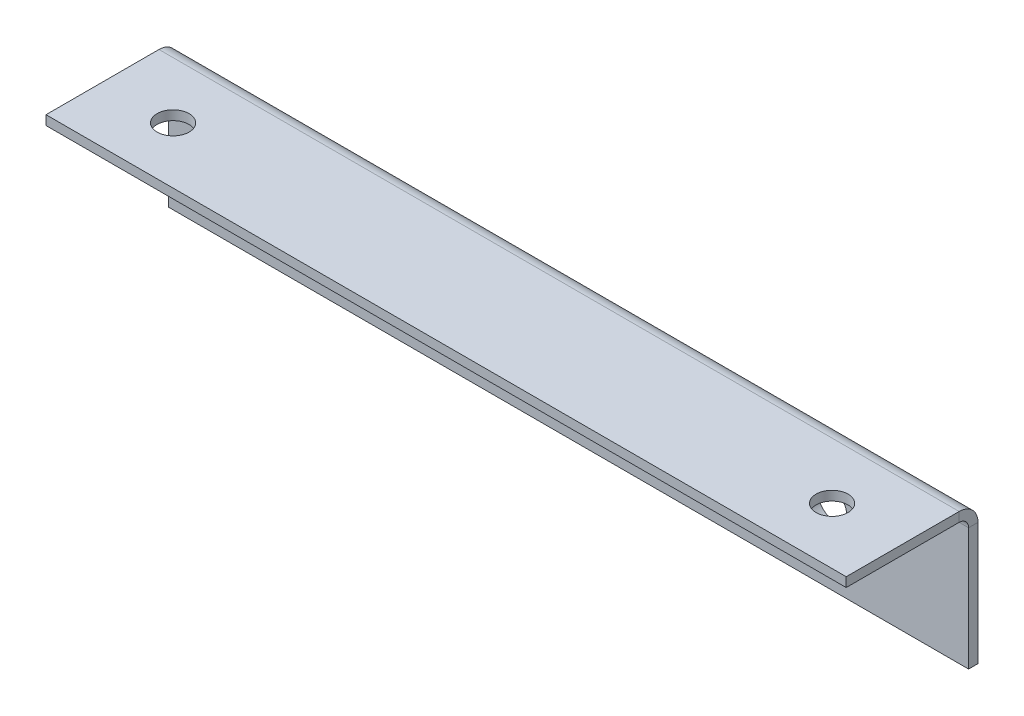
ISO-10303-21;
HEADER;
FILE_DESCRIPTION(('STEP AP214'),'2;1');
FILE_NAME('part.step','',(''),(''),'','','');
FILE_SCHEMA(('AUTOMOTIVE_DESIGN { 1 0 10303 214 1 1 1 1 }'));
ENDSEC;
DATA;
#1=APPLICATION_CONTEXT('core data for automotive mechanical design processes');
#2=APPLICATION_PROTOCOL_DEFINITION('international standard','automotive_design',2000,#1);
#3=PRODUCT_CONTEXT('',#1,'mechanical');
#4=PRODUCT('Part','Part','',(#3));
#5=PRODUCT_RELATED_PRODUCT_CATEGORY('part','',(#4));
#6=PRODUCT_DEFINITION_FORMATION('','',#4);
#7=PRODUCT_DEFINITION_CONTEXT('part definition',#1,'design');
#8=PRODUCT_DEFINITION('design','',#6,#7);
#9=PRODUCT_DEFINITION_SHAPE('','',#8);
#10=(LENGTH_UNIT() NAMED_UNIT(*) SI_UNIT(.MILLI.,.METRE.));
#11=(NAMED_UNIT(*) PLANE_ANGLE_UNIT() SI_UNIT($,.RADIAN.));
#12=(NAMED_UNIT(*) SI_UNIT($,.STERADIAN.) SOLID_ANGLE_UNIT());
#13=UNCERTAINTY_MEASURE_WITH_UNIT(LENGTH_MEASURE(1.E-05),#10,'distance_accuracy_value','');
#14=(GEOMETRIC_REPRESENTATION_CONTEXT(3) GLOBAL_UNCERTAINTY_ASSIGNED_CONTEXT((#13)) GLOBAL_UNIT_ASSIGNED_CONTEXT((#10,
#11,#12)) REPRESENTATION_CONTEXT('',''));
#15=CARTESIAN_POINT('',(0.,0.,0.));
#16=DIRECTION('',(0.,0.,1.));
#17=DIRECTION('',(1.,0.,0.));
#18=AXIS2_PLACEMENT_3D('',#15,#16,#17);
#19=CARTESIAN_POINT('',(-42.5,7.49999999999999,-1.));
#20=DIRECTION('',(-1.,0.,0.));
#21=DIRECTION('',(0.,0.,1.));
#22=AXIS2_PLACEMENT_3D('',#19,#20,#21);
#23=PLANE('',#22);
#24=DIRECTION('',(0.,-1.,0.));
#25=VECTOR('',#24,1.);
#26=CARTESIAN_POINT('',(-42.5,7.49999999999999,0.));
#27=LINE('',#26,#25);
#28=CARTESIAN_POINT('',(-42.5,5.5,0.));
#29=VERTEX_POINT('',#28);
#30=CARTESIAN_POINT('',(-42.5,-7.50000000000001,0.));
#31=VERTEX_POINT('',#30);
#32=EDGE_CURVE('E123',#29,#31,#27,.T.);
#33=ORIENTED_EDGE('',*,*,#32,.F.);
#34=DIRECTION('',(0.,0.,-1.));
#35=VECTOR('',#34,1.);
#36=CARTESIAN_POINT('',(-42.5,5.5,0.));
#37=LINE('',#36,#35);
#38=CARTESIAN_POINT('',(-42.5,5.49999999999999,-1.00000000000001));
#39=VERTEX_POINT('',#38);
#40=EDGE_CURVE('E132',#29,#39,#37,.T.);
#41=ORIENTED_EDGE('',*,*,#40,.T.);
#42=DIRECTION('',(0.,-1.,0.));
#43=VECTOR('',#42,1.);
#44=CARTESIAN_POINT('',(-42.5,7.49999999999999,-1.));
#45=LINE('',#44,#43);
#46=CARTESIAN_POINT('',(-42.5,-7.50000000000001,-1.));
#47=VERTEX_POINT('',#46);
#48=EDGE_CURVE('E119',#39,#47,#45,.T.);
#49=ORIENTED_EDGE('',*,*,#48,.T.);
#50=DIRECTION('',(0.,0.,1.));
#51=VECTOR('',#50,1.);
#52=CARTESIAN_POINT('',(-42.5,-7.50000000000001,-1.));
#53=LINE('',#52,#51);
#54=EDGE_CURVE('E74',#47,#31,#53,.T.);
#55=ORIENTED_EDGE('',*,*,#54,.T.);
#56=EDGE_LOOP('',(#33,#41,#49,#55));
#57=FACE_BOUND('',#56,.T.);
#58=ADVANCED_FACE('F71',(#57),#23,.T.);
#59=CARTESIAN_POINT('',(0.,0.,-1.));
#60=DIRECTION('',(0.,0.,-1.));
#61=DIRECTION('',(-1.,0.,0.));
#62=AXIS2_PLACEMENT_3D('',#59,#60,#61);
#63=PLANE('',#62);
#64=CARTESIAN_POINT('',(-27.5,0.,-0.999999999999999));
#65=DIRECTION('',(0.,0.,-1.));
#66=DIRECTION('',(-1.,0.,0.));
#67=AXIS2_PLACEMENT_3D('',#64,#65,#66);
#68=CIRCLE('',#67,2.1);
#69=CARTESIAN_POINT('',(-29.6,0.,-0.999999999999999));
#70=VERTEX_POINT('',#69);
#71=EDGE_CURVE('E157',#70,#70,#68,.T.);
#72=ORIENTED_EDGE('',*,*,#71,.F.);
#73=EDGE_LOOP('',(#72));
#74=FACE_BOUND('',#73,.T.);
#75=CARTESIAN_POINT('',(27.5,0.,-0.999999999999999));
#76=DIRECTION('',(0.,0.,-1.));
#77=DIRECTION('',(-1.,0.,0.));
#78=AXIS2_PLACEMENT_3D('',#75,#76,#77);
#79=CIRCLE('',#78,2.1);
#80=CARTESIAN_POINT('',(25.4,0.,-0.999999999999999));
#81=VERTEX_POINT('',#80);
#82=EDGE_CURVE('E190',#81,#81,#79,.T.);
#83=ORIENTED_EDGE('',*,*,#82,.F.);
#84=EDGE_LOOP('',(#83));
#85=FACE_BOUND('',#84,.T.);
#86=ORIENTED_EDGE('',*,*,#48,.F.);
#87=DIRECTION('',(-1.,0.,0.));
#88=VECTOR('',#87,1.);
#89=CARTESIAN_POINT('',(-42.5,5.49999999999999,-1.00000000000001));
#90=LINE('',#89,#88);
#91=CARTESIAN_POINT('',(42.5,5.5,-1.));
#92=VERTEX_POINT('',#91);
#93=EDGE_CURVE('E149',#39,#92,#90,.F.);
#94=ORIENTED_EDGE('',*,*,#93,.T.);
#95=DIRECTION('',(0.,1.,0.));
#96=VECTOR('',#95,1.);
#97=CARTESIAN_POINT('',(42.5,7.50000000000001,-1.));
#98=LINE('',#97,#96);
#99=CARTESIAN_POINT('',(42.5,-7.49999999999999,-1.));
#100=VERTEX_POINT('',#99);
#101=EDGE_CURVE('E128',#100,#92,#98,.T.);
#102=ORIENTED_EDGE('',*,*,#101,.F.);
#103=DIRECTION('',(1.,0.,0.));
#104=VECTOR('',#103,1.);
#105=CARTESIAN_POINT('',(42.5,-7.49999999999999,-1.));
#106=LINE('',#105,#104);
#107=EDGE_CURVE('E110',#47,#100,#106,.T.);
#108=ORIENTED_EDGE('',*,*,#107,.F.);
#109=EDGE_LOOP('',(#86,#94,#102,#108));
#110=FACE_BOUND('',#109,.T.);
#111=ADVANCED_FACE('F269',(#74,#85,#110),#63,.T.);
#112=CARTESIAN_POINT('',(0.,0.,0.));
#113=DIRECTION('',(0.,0.,-1.));
#114=DIRECTION('',(-1.,0.,0.));
#115=AXIS2_PLACEMENT_3D('',#112,#113,#114);
#116=PLANE('',#115);
#117=CARTESIAN_POINT('',(-27.5,0.,0.));
#118=DIRECTION('',(0.,0.,1.));
#119=DIRECTION('',(1.,0.,0.));
#120=AXIS2_PLACEMENT_3D('',#117,#118,#119);
#121=CIRCLE('',#120,2.1);
#122=CARTESIAN_POINT('',(-25.4,0.,0.));
#123=VERTEX_POINT('',#122);
#124=EDGE_CURVE('E193',#123,#123,#121,.T.);
#125=ORIENTED_EDGE('',*,*,#124,.F.);
#126=EDGE_LOOP('',(#125));
#127=FACE_BOUND('',#126,.T.);
#128=CARTESIAN_POINT('',(27.5,0.,0.));
#129=DIRECTION('',(0.,0.,1.));
#130=DIRECTION('',(1.,0.,0.));
#131=AXIS2_PLACEMENT_3D('',#128,#129,#130);
#132=CIRCLE('',#131,2.1);
#133=CARTESIAN_POINT('',(29.6,0.,0.));
#134=VERTEX_POINT('',#133);
#135=EDGE_CURVE('E194',#134,#134,#132,.T.);
#136=ORIENTED_EDGE('',*,*,#135,.F.);
#137=EDGE_LOOP('',(#136));
#138=FACE_BOUND('',#137,.T.);
#139=DIRECTION('',(-1.,0.,0.));
#140=VECTOR('',#139,1.);
#141=CARTESIAN_POINT('',(-42.5,5.5,0.));
#142=LINE('',#141,#140);
#143=CARTESIAN_POINT('',(42.5,5.5,0.));
#144=VERTEX_POINT('',#143);
#145=EDGE_CURVE('E139',#29,#144,#142,.F.);
#146=ORIENTED_EDGE('',*,*,#145,.F.);
#147=ORIENTED_EDGE('',*,*,#32,.T.);
#148=DIRECTION('',(1.,0.,0.));
#149=VECTOR('',#148,1.);
#150=CARTESIAN_POINT('',(42.5,-7.49999999999999,0.));
#151=LINE('',#150,#149);
#152=CARTESIAN_POINT('',(42.5,-7.49999999999999,0.));
#153=VERTEX_POINT('',#152);
#154=EDGE_CURVE('E108',#31,#153,#151,.T.);
#155=ORIENTED_EDGE('',*,*,#154,.T.);
#156=DIRECTION('',(0.,1.,0.));
#157=VECTOR('',#156,1.);
#158=CARTESIAN_POINT('',(42.5,7.50000000000001,0.));
#159=LINE('',#158,#157);
#160=EDGE_CURVE('E113',#153,#144,#159,.T.);
#161=ORIENTED_EDGE('',*,*,#160,.T.);
#162=EDGE_LOOP('',(#146,#147,#155,#161));
#163=FACE_BOUND('',#162,.T.);
#164=ADVANCED_FACE('F121',(#127,#138,#163),#116,.F.);
#165=CARTESIAN_POINT('',(42.5,7.50000000000001,-1.));
#166=DIRECTION('',(1.,0.,0.));
#167=DIRECTION('',(0.,1.,0.));
#168=AXIS2_PLACEMENT_3D('',#165,#166,#167);
#169=PLANE('',#168);
#170=DIRECTION('',(0.,0.,-1.));
#171=VECTOR('',#170,1.);
#172=CARTESIAN_POINT('',(42.5,5.5,0.));
#173=LINE('',#172,#171);
#174=EDGE_CURVE('E116',#144,#92,#173,.T.);
#175=ORIENTED_EDGE('',*,*,#174,.F.);
#176=ORIENTED_EDGE('',*,*,#160,.F.);
#177=DIRECTION('',(0.,0.,1.));
#178=VECTOR('',#177,1.);
#179=CARTESIAN_POINT('',(42.5,-7.49999999999999,-1.));
#180=LINE('',#179,#178);
#181=EDGE_CURVE('E15',#100,#153,#180,.T.);
#182=ORIENTED_EDGE('',*,*,#181,.F.);
#183=ORIENTED_EDGE('',*,*,#101,.T.);
#184=EDGE_LOOP('',(#175,#176,#182,#183));
#185=FACE_BOUND('',#184,.T.);
#186=ADVANCED_FACE('F114',(#185),#169,.T.);
#187=CARTESIAN_POINT('',(42.5,-7.49999999999999,-1.));
#188=DIRECTION('',(0.,-1.,0.));
#189=DIRECTION('',(1.,0.,0.));
#190=AXIS2_PLACEMENT_3D('',#187,#188,#189);
#191=PLANE('',#190);
#192=ORIENTED_EDGE('',*,*,#154,.F.);
#193=ORIENTED_EDGE('',*,*,#54,.F.);
#194=ORIENTED_EDGE('',*,*,#107,.T.);
#195=ORIENTED_EDGE('',*,*,#181,.T.);
#196=EDGE_LOOP('',(#192,#193,#194,#195));
#197=FACE_BOUND('',#196,.T.);
#198=ADVANCED_FACE('F105',(#197),#191,.T.);
#199=CARTESIAN_POINT('',(42.5,5.5,1.));
#200=DIRECTION('',(1.,0.,0.));
#201=DIRECTION('',(0.,0.,-1.));
#202=AXIS2_PLACEMENT_3D('',#199,#200,#201);
#203=PLANE('',#202);
#204=DIRECTION('',(0.,-1.,0.));
#205=VECTOR('',#204,1.);
#206=CARTESIAN_POINT('',(42.5,7.50000000000001,0.999999999999993));
#207=LINE('',#206,#205);
#208=CARTESIAN_POINT('',(42.5,6.50000000000001,0.999999999999998));
#209=VERTEX_POINT('',#208);
#210=CARTESIAN_POINT('',(42.5,7.50000000000001,0.999999999999994));
#211=VERTEX_POINT('',#210);
#212=EDGE_CURVE('E153',#209,#211,#207,.F.);
#213=ORIENTED_EDGE('',*,*,#212,.F.);
#214=CARTESIAN_POINT('',(42.5,5.5,1.));
#215=DIRECTION('',(-1.,0.,0.));
#216=DIRECTION('',(0.,0.,1.));
#217=AXIS2_PLACEMENT_3D('',#214,#215,#216);
#218=CIRCLE('',#217,1.00000000000001);
#219=EDGE_CURVE('E143',#144,#209,#218,.F.);
#220=ORIENTED_EDGE('',*,*,#219,.F.);
#221=ORIENTED_EDGE('',*,*,#174,.T.);
#222=CARTESIAN_POINT('',(42.5,5.5,1.));
#223=DIRECTION('',(-1.,0.,0.));
#224=DIRECTION('',(0.,0.,1.));
#225=AXIS2_PLACEMENT_3D('',#222,#223,#224);
#226=CIRCLE('',#225,2.00000000000001);
#227=EDGE_CURVE('E85',#92,#211,#226,.F.);
#228=ORIENTED_EDGE('',*,*,#227,.T.);
#229=EDGE_LOOP('',(#213,#220,#221,#228));
#230=FACE_BOUND('',#229,.T.);
#231=ADVANCED_FACE('F272',(#230),#203,.T.);
#232=CARTESIAN_POINT('',(-42.5,5.5,1.));
#233=DIRECTION('',(1.,0.,0.));
#234=DIRECTION('',(0.,0.,-1.));
#235=AXIS2_PLACEMENT_3D('',#232,#233,#234);
#236=PLANE('',#235);
#237=CARTESIAN_POINT('',(-42.5,5.5,1.));
#238=DIRECTION('',(-1.,0.,0.));
#239=DIRECTION('',(0.,0.,1.));
#240=AXIS2_PLACEMENT_3D('',#237,#238,#239);
#241=CIRCLE('',#240,1.00000000000001);
#242=CARTESIAN_POINT('',(-42.5,6.50000000000001,0.999999999999998));
#243=VERTEX_POINT('',#242);
#244=EDGE_CURVE('E136',#243,#29,#241,.T.);
#245=ORIENTED_EDGE('',*,*,#244,.F.);
#246=DIRECTION('',(0.,-1.,0.));
#247=VECTOR('',#246,1.);
#248=CARTESIAN_POINT('',(-42.5,6.5,0.999999999999999));
#249=LINE('',#248,#247);
#250=CARTESIAN_POINT('',(-42.5,7.5,0.999999999999996));
#251=VERTEX_POINT('',#250);
#252=EDGE_CURVE('E160',#243,#251,#249,.F.);
#253=ORIENTED_EDGE('',*,*,#252,.T.);
#254=CARTESIAN_POINT('',(-42.5,5.5,1.));
#255=DIRECTION('',(-1.,0.,0.));
#256=DIRECTION('',(0.,0.,1.));
#257=AXIS2_PLACEMENT_3D('',#254,#255,#256);
#258=CIRCLE('',#257,2.00000000000001);
#259=EDGE_CURVE('E146',#251,#39,#258,.T.);
#260=ORIENTED_EDGE('',*,*,#259,.T.);
#261=ORIENTED_EDGE('',*,*,#40,.F.);
#262=EDGE_LOOP('',(#245,#253,#260,#261));
#263=FACE_BOUND('',#262,.T.);
#264=ADVANCED_FACE('F262',(#263),#236,.F.);
#265=CARTESIAN_POINT('',(-42.5,5.5,1.));
#266=DIRECTION('',(-1.,0.,0.));
#267=DIRECTION('',(0.,1.,0.));
#268=AXIS2_PLACEMENT_3D('',#265,#266,#267);
#269=CYLINDRICAL_SURFACE('',#268,2.00000000000001);
#270=ORIENTED_EDGE('',*,*,#93,.F.);
#271=ORIENTED_EDGE('',*,*,#259,.F.);
#272=DIRECTION('',(-1.,0.,0.));
#273=VECTOR('',#272,1.);
#274=CARTESIAN_POINT('',(42.5,7.50000000000001,0.999999999999993));
#275=LINE('',#274,#273);
#276=EDGE_CURVE('E163',#251,#211,#275,.F.);
#277=ORIENTED_EDGE('',*,*,#276,.T.);
#278=ORIENTED_EDGE('',*,*,#227,.F.);
#279=EDGE_LOOP('',(#270,#271,#277,#278));
#280=FACE_BOUND('',#279,.T.);
#281=ADVANCED_FACE('F270',(#280),#269,.T.);
#282=CARTESIAN_POINT('',(-42.5,5.5,1.));
#283=DIRECTION('',(-1.,0.,0.));
#284=DIRECTION('',(0.,1.,0.));
#285=AXIS2_PLACEMENT_3D('',#282,#283,#284);
#286=CYLINDRICAL_SURFACE('',#285,1.00000000000001);
#287=ORIENTED_EDGE('',*,*,#145,.T.);
#288=ORIENTED_EDGE('',*,*,#219,.T.);
#289=DIRECTION('',(-1.,0.,0.));
#290=VECTOR('',#289,1.);
#291=CARTESIAN_POINT('',(42.5,6.50000000000001,0.999999999999997));
#292=LINE('',#291,#290);
#293=EDGE_CURVE('E156',#209,#243,#292,.T.);
#294=ORIENTED_EDGE('',*,*,#293,.T.);
#295=ORIENTED_EDGE('',*,*,#244,.T.);
#296=EDGE_LOOP('',(#287,#288,#294,#295));
#297=FACE_BOUND('',#296,.T.);
#298=ADVANCED_FACE('F266',(#297),#286,.F.);
#299=CARTESIAN_POINT('',(42.5,7.50000000000001,0.));
#300=DIRECTION('',(-1.,0.,0.));
#301=DIRECTION('',(0.,-1.,0.));
#302=AXIS2_PLACEMENT_3D('',#299,#300,#301);
#303=PLANE('',#302);
#304=ORIENTED_EDGE('',*,*,#212,.T.);
#305=DIRECTION('',(0.,0.,-1.));
#306=VECTOR('',#305,1.);
#307=CARTESIAN_POINT('',(42.5,7.50000000000001,0.));
#308=LINE('',#307,#306);
#309=CARTESIAN_POINT('',(42.5,7.50000000000005,13.));
#310=VERTEX_POINT('',#309);
#311=EDGE_CURVE('E174',#310,#211,#308,.T.);
#312=ORIENTED_EDGE('',*,*,#311,.F.);
#313=DIRECTION('',(0.,-1.,0.));
#314=VECTOR('',#313,1.);
#315=CARTESIAN_POINT('',(42.5,7.50000000000005,13.));
#316=LINE('',#315,#314);
#317=CARTESIAN_POINT('',(42.5,6.50000000000005,13.));
#318=VERTEX_POINT('',#317);
#319=EDGE_CURVE('E183',#310,#318,#316,.T.);
#320=ORIENTED_EDGE('',*,*,#319,.T.);
#321=DIRECTION('',(0.,0.,1.));
#322=VECTOR('',#321,1.);
#323=CARTESIAN_POINT('',(42.5,6.50000000000001,0.));
#324=LINE('',#323,#322);
#325=EDGE_CURVE('E165',#318,#209,#324,.F.);
#326=ORIENTED_EDGE('',*,*,#325,.T.);
#327=EDGE_LOOP('',(#304,#312,#320,#326));
#328=FACE_BOUND('',#327,.T.);
#329=ADVANCED_FACE('F274',(#328),#303,.F.);
#330=CARTESIAN_POINT('',(-42.5,7.50000000000004,13.));
#331=DIRECTION('',(1.,0.,0.));
#332=DIRECTION('',(0.,1.,0.));
#333=AXIS2_PLACEMENT_3D('',#330,#331,#332);
#334=PLANE('',#333);
#335=ORIENTED_EDGE('',*,*,#252,.F.);
#336=DIRECTION('',(0.,0.,-1.));
#337=VECTOR('',#336,1.);
#338=CARTESIAN_POINT('',(-42.5,6.50000000000004,13.));
#339=LINE('',#338,#337);
#340=CARTESIAN_POINT('',(-42.5,6.50000000000004,13.));
#341=VERTEX_POINT('',#340);
#342=EDGE_CURVE('E168',#243,#341,#339,.F.);
#343=ORIENTED_EDGE('',*,*,#342,.T.);
#344=DIRECTION('',(0.,-1.,0.));
#345=VECTOR('',#344,1.);
#346=CARTESIAN_POINT('',(-42.5,7.50000000000004,13.));
#347=LINE('',#346,#345);
#348=CARTESIAN_POINT('',(-42.5,7.50000000000004,13.));
#349=VERTEX_POINT('',#348);
#350=EDGE_CURVE('E140',#349,#341,#347,.T.);
#351=ORIENTED_EDGE('',*,*,#350,.F.);
#352=DIRECTION('',(0.,0.,1.));
#353=VECTOR('',#352,1.);
#354=CARTESIAN_POINT('',(-42.5,7.49999999999999,0.));
#355=LINE('',#354,#353);
#356=EDGE_CURVE('E177',#251,#349,#355,.T.);
#357=ORIENTED_EDGE('',*,*,#356,.F.);
#358=EDGE_LOOP('',(#335,#343,#351,#357));
#359=FACE_BOUND('',#358,.T.);
#360=ADVANCED_FACE('F234',(#359),#334,.F.);
#361=CARTESIAN_POINT('',(0.,7.5,0.));
#362=DIRECTION('',(0.,-1.,0.));
#363=DIRECTION('',(0.,0.,-1.));
#364=AXIS2_PLACEMENT_3D('',#361,#362,#363);
#365=PLANE('',#364);
#366=CARTESIAN_POINT('',(35.,7.50000000000003,7.));
#367=DIRECTION('',(0.,-1.,0.));
#368=DIRECTION('',(0.,0.,-1.));
#369=AXIS2_PLACEMENT_3D('',#366,#367,#368);
#370=CIRCLE('',#369,1.7);
#371=CARTESIAN_POINT('',(35.,7.50000000000002,5.3));
#372=VERTEX_POINT('',#371);
#373=EDGE_CURVE('E205',#372,#372,#370,.T.);
#374=ORIENTED_EDGE('',*,*,#373,.T.);
#375=EDGE_LOOP('',(#374));
#376=FACE_BOUND('',#375,.T.);
#377=CARTESIAN_POINT('',(-35.,7.50000000000002,7.));
#378=DIRECTION('',(0.,-1.,0.));
#379=DIRECTION('',(0.,0.,-1.));
#380=AXIS2_PLACEMENT_3D('',#377,#378,#379);
#381=CIRCLE('',#380,1.7);
#382=CARTESIAN_POINT('',(-35.,7.50000000000001,5.3));
#383=VERTEX_POINT('',#382);
#384=EDGE_CURVE('E197',#383,#383,#381,.T.);
#385=ORIENTED_EDGE('',*,*,#384,.T.);
#386=EDGE_LOOP('',(#385));
#387=FACE_BOUND('',#386,.T.);
#388=ORIENTED_EDGE('',*,*,#276,.F.);
#389=ORIENTED_EDGE('',*,*,#356,.T.);
#390=DIRECTION('',(1.,0.,0.));
#391=VECTOR('',#390,1.);
#392=CARTESIAN_POINT('',(0.,7.50000000000005,13.));
#393=LINE('',#392,#391);
#394=EDGE_CURVE('E180',#349,#310,#393,.T.);
#395=ORIENTED_EDGE('',*,*,#394,.T.);
#396=ORIENTED_EDGE('',*,*,#311,.T.);
#397=EDGE_LOOP('',(#388,#389,#395,#396));
#398=FACE_BOUND('',#397,.T.);
#399=ADVANCED_FACE('F219',(#376,#387,#398),#365,.F.);
#400=CARTESIAN_POINT('',(0.,6.5,0.));
#401=DIRECTION('',(0.,-1.,0.));
#402=DIRECTION('',(0.,0.,-1.));
#403=AXIS2_PLACEMENT_3D('',#400,#401,#402);
#404=PLANE('',#403);
#405=CARTESIAN_POINT('',(35.,6.50000000000003,7.));
#406=DIRECTION('',(0.,-1.,0.));
#407=DIRECTION('',(0.,0.,-1.));
#408=AXIS2_PLACEMENT_3D('',#405,#406,#407);
#409=CIRCLE('',#408,1.7);
#410=CARTESIAN_POINT('',(35.,6.50000000000003,5.3));
#411=VERTEX_POINT('',#410);
#412=EDGE_CURVE('E208',#411,#411,#409,.T.);
#413=ORIENTED_EDGE('',*,*,#412,.F.);
#414=EDGE_LOOP('',(#413));
#415=FACE_BOUND('',#414,.T.);
#416=CARTESIAN_POINT('',(-35.,6.50000000000002,7.));
#417=DIRECTION('',(0.,-1.,0.));
#418=DIRECTION('',(0.,0.,-1.));
#419=AXIS2_PLACEMENT_3D('',#416,#417,#418);
#420=CIRCLE('',#419,1.7);
#421=CARTESIAN_POINT('',(-35.,6.50000000000002,5.3));
#422=VERTEX_POINT('',#421);
#423=EDGE_CURVE('E202',#422,#422,#420,.T.);
#424=ORIENTED_EDGE('',*,*,#423,.F.);
#425=EDGE_LOOP('',(#424));
#426=FACE_BOUND('',#425,.T.);
#427=ORIENTED_EDGE('',*,*,#342,.F.);
#428=ORIENTED_EDGE('',*,*,#293,.F.);
#429=ORIENTED_EDGE('',*,*,#325,.F.);
#430=DIRECTION('',(-1.,0.,0.));
#431=VECTOR('',#430,1.);
#432=CARTESIAN_POINT('',(42.5,6.50000000000005,13.));
#433=LINE('',#432,#431);
#434=EDGE_CURVE('E171',#341,#318,#433,.F.);
#435=ORIENTED_EDGE('',*,*,#434,.F.);
#436=EDGE_LOOP('',(#427,#428,#429,#435));
#437=FACE_BOUND('',#436,.T.);
#438=ADVANCED_FACE('F215',(#415,#426,#437),#404,.T.);
#439=CARTESIAN_POINT('',(42.5,7.50000000000005,13.));
#440=DIRECTION('',(0.,0.,-1.));
#441=DIRECTION('',(0.,1.,0.));
#442=AXIS2_PLACEMENT_3D('',#439,#440,#441);
#443=PLANE('',#442);
#444=ORIENTED_EDGE('',*,*,#434,.T.);
#445=ORIENTED_EDGE('',*,*,#319,.F.);
#446=ORIENTED_EDGE('',*,*,#394,.F.);
#447=ORIENTED_EDGE('',*,*,#350,.T.);
#448=EDGE_LOOP('',(#444,#445,#446,#447));
#449=FACE_BOUND('',#448,.T.);
#450=ADVANCED_FACE('F218',(#449),#443,.F.);
#451=CARTESIAN_POINT('',(27.5,0.,-10.));
#452=DIRECTION('',(0.,0.,1.));
#453=DIRECTION('',(1.,0.,0.));
#454=AXIS2_PLACEMENT_3D('',#451,#452,#453);
#455=CYLINDRICAL_SURFACE('',#454,2.1);
#456=ORIENTED_EDGE('',*,*,#82,.T.);
#457=EDGE_LOOP('',(#456));
#458=FACE_BOUND('',#457,.T.);
#459=ORIENTED_EDGE('',*,*,#135,.T.);
#460=EDGE_LOOP('',(#459));
#461=FACE_BOUND('',#460,.T.);
#462=ADVANCED_FACE('F340',(#458,#461),#455,.F.);
#463=CARTESIAN_POINT('',(-27.5,0.,-10.));
#464=DIRECTION('',(0.,0.,1.));
#465=DIRECTION('',(1.,0.,0.));
#466=AXIS2_PLACEMENT_3D('',#463,#464,#465);
#467=CYLINDRICAL_SURFACE('',#466,2.1);
#468=ORIENTED_EDGE('',*,*,#71,.T.);
#469=EDGE_LOOP('',(#468));
#470=FACE_BOUND('',#469,.T.);
#471=ORIENTED_EDGE('',*,*,#124,.T.);
#472=EDGE_LOOP('',(#471));
#473=FACE_BOUND('',#472,.T.);
#474=ADVANCED_FACE('F364',(#470,#473),#467,.F.);
#475=CARTESIAN_POINT('',(-35.,6.50000000000002,7.));
#476=DIRECTION('',(0.,-1.,0.));
#477=DIRECTION('',(0.,0.,-1.));
#478=AXIS2_PLACEMENT_3D('',#475,#476,#477);
#479=CYLINDRICAL_SURFACE('',#478,1.7);
#480=ORIENTED_EDGE('',*,*,#423,.T.);
#481=EDGE_LOOP('',(#480));
#482=FACE_BOUND('',#481,.T.);
#483=ORIENTED_EDGE('',*,*,#384,.F.);
#484=EDGE_LOOP('',(#483));
#485=FACE_BOUND('',#484,.T.);
#486=ADVANCED_FACE('F374',(#482,#485),#479,.F.);
#487=CARTESIAN_POINT('',(35.,6.50000000000003,7.));
#488=DIRECTION('',(0.,-1.,0.));
#489=DIRECTION('',(0.,0.,-1.));
#490=AXIS2_PLACEMENT_3D('',#487,#488,#489);
#491=CYLINDRICAL_SURFACE('',#490,1.7);
#492=ORIENTED_EDGE('',*,*,#412,.T.);
#493=EDGE_LOOP('',(#492));
#494=FACE_BOUND('',#493,.T.);
#495=ORIENTED_EDGE('',*,*,#373,.F.);
#496=EDGE_LOOP('',(#495));
#497=FACE_BOUND('',#496,.T.);
#498=ADVANCED_FACE('F212',(#494,#497),#491,.F.);
#499=CLOSED_SHELL('',(#58,#111,#164,#186,#198,#231,#264,#281,#298,#329,#360,#399,#438,#450,#462,
#474,#486,#498));
#500=MANIFOLD_SOLID_BREP('B2',#499);
#501=ADVANCED_BREP_SHAPE_REPRESENTATION('',(#18,#500),#14);
#502=SHAPE_DEFINITION_REPRESENTATION(#9,#501);
ENDSEC;
END-ISO-10303-21;
